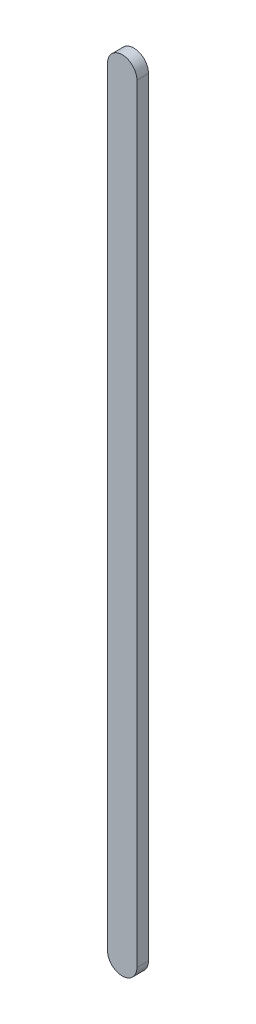
ISO-10303-21;
HEADER;
FILE_DESCRIPTION(('STEP AP214'),'2;1');
FILE_NAME('part.step','',(''),(''),'','','');
FILE_SCHEMA(('AUTOMOTIVE_DESIGN { 1 0 10303 214 1 1 1 1 }'));
ENDSEC;
DATA;
#1=APPLICATION_CONTEXT('core data for automotive mechanical design processes');
#2=APPLICATION_PROTOCOL_DEFINITION('international standard','automotive_design',2000,#1);
#3=PRODUCT_CONTEXT('',#1,'mechanical');
#4=PRODUCT('Part','Part','',(#3));
#5=PRODUCT_RELATED_PRODUCT_CATEGORY('part','',(#4));
#6=PRODUCT_DEFINITION_FORMATION('','',#4);
#7=PRODUCT_DEFINITION_CONTEXT('part definition',#1,'design');
#8=PRODUCT_DEFINITION('design','',#6,#7);
#9=PRODUCT_DEFINITION_SHAPE('','',#8);
#10=(LENGTH_UNIT() NAMED_UNIT(*) SI_UNIT(.MILLI.,.METRE.));
#11=(NAMED_UNIT(*) PLANE_ANGLE_UNIT() SI_UNIT($,.RADIAN.));
#12=(NAMED_UNIT(*) SI_UNIT($,.STERADIAN.) SOLID_ANGLE_UNIT());
#13=UNCERTAINTY_MEASURE_WITH_UNIT(LENGTH_MEASURE(1.E-05),#10,'distance_accuracy_value','');
#14=(GEOMETRIC_REPRESENTATION_CONTEXT(3) GLOBAL_UNCERTAINTY_ASSIGNED_CONTEXT((#13)) GLOBAL_UNIT_ASSIGNED_CONTEXT((#10,
#11,#12)) REPRESENTATION_CONTEXT('',''));
#15=CARTESIAN_POINT('',(0.,0.,0.));
#16=DIRECTION('',(0.,0.,1.));
#17=DIRECTION('',(1.,0.,0.));
#18=AXIS2_PLACEMENT_3D('',#15,#16,#17);
#19=CARTESIAN_POINT('',(107.4928,73.279,0.));
#20=DIRECTION('',(-1.,0.,0.));
#21=DIRECTION('',(0.,1.,0.));
#22=AXIS2_PLACEMENT_3D('',#19,#20,#21);
#23=PLANE('',#22);
#24=DIRECTION('',(0.,1.,0.));
#25=VECTOR('',#24,1.);
#26=CARTESIAN_POINT('',(107.4928,73.279,0.1999996));
#27=LINE('',#26,#25);
#28=CARTESIAN_POINT('',(107.4928,73.279,0.1999996));
#29=VERTEX_POINT('',#28);
#30=CARTESIAN_POINT('',(107.4928,86.5348028,0.1999996));
#31=VERTEX_POINT('',#30);
#32=EDGE_CURVE('E11',#29,#31,#27,.T.);
#33=ORIENTED_EDGE('',*,*,#32,.F.);
#34=DIRECTION('',(0.,0.,1.));
#35=VECTOR('',#34,1.);
#36=CARTESIAN_POINT('',(107.4928,73.279,0.));
#37=LINE('',#36,#35);
#38=CARTESIAN_POINT('',(107.4928,73.279,0.));
#39=VERTEX_POINT('',#38);
#40=EDGE_CURVE('E24',#39,#29,#37,.T.);
#41=ORIENTED_EDGE('',*,*,#40,.F.);
#42=DIRECTION('',(0.,1.,0.));
#43=VECTOR('',#42,1.);
#44=CARTESIAN_POINT('',(107.4928,73.279,0.));
#45=LINE('',#44,#43);
#46=CARTESIAN_POINT('',(107.4928,86.5348028,0.));
#47=VERTEX_POINT('',#46);
#48=EDGE_CURVE('E75',#39,#47,#45,.T.);
#49=ORIENTED_EDGE('',*,*,#48,.T.);
#50=DIRECTION('',(0.,0.,1.));
#51=VECTOR('',#50,1.);
#52=CARTESIAN_POINT('',(107.4928,86.5348028,0.));
#53=LINE('',#52,#51);
#54=EDGE_CURVE('E37',#47,#31,#53,.T.);
#55=ORIENTED_EDGE('',*,*,#54,.T.);
#56=EDGE_LOOP('',(#33,#41,#49,#55));
#57=FACE_BOUND('',#56,.T.);
#58=ADVANCED_FACE('F17',(#57),#23,.F.);
#59=CARTESIAN_POINT('',(107.2388,86.5348028,0.));
#60=DIRECTION('',(0.,0.,-1.));
#61=DIRECTION('',(1.,0.,0.));
#62=AXIS2_PLACEMENT_3D('',#59,#60,#61);
#63=CYLINDRICAL_SURFACE('',#62,0.253999999999995);
#64=CARTESIAN_POINT('',(107.2388,86.5348028,0.1999996));
#65=DIRECTION('',(0.,0.,1.));
#66=DIRECTION('',(1.,0.,0.));
#67=AXIS2_PLACEMENT_3D('',#64,#65,#66);
#68=CIRCLE('',#67,0.253999999999995);
#69=CARTESIAN_POINT('',(106.9848,86.5348028,0.1999996));
#70=VERTEX_POINT('',#69);
#71=EDGE_CURVE('E83',#31,#70,#68,.T.);
#72=ORIENTED_EDGE('',*,*,#71,.F.);
#73=ORIENTED_EDGE('',*,*,#54,.F.);
#74=CARTESIAN_POINT('',(107.2388,86.5348028,0.));
#75=DIRECTION('',(0.,0.,1.));
#76=DIRECTION('',(1.,0.,0.));
#77=AXIS2_PLACEMENT_3D('',#74,#75,#76);
#78=CIRCLE('',#77,0.253999999999995);
#79=CARTESIAN_POINT('',(106.9848,86.5348028,0.));
#80=VERTEX_POINT('',#79);
#81=EDGE_CURVE('E81',#47,#80,#78,.T.);
#82=ORIENTED_EDGE('',*,*,#81,.T.);
#83=DIRECTION('',(0.,0.,1.));
#84=VECTOR('',#83,1.);
#85=CARTESIAN_POINT('',(106.9848,86.5348028,0.));
#86=LINE('',#85,#84);
#87=EDGE_CURVE('E67',#80,#70,#86,.T.);
#88=ORIENTED_EDGE('',*,*,#87,.T.);
#89=EDGE_LOOP('',(#72,#73,#82,#88));
#90=FACE_BOUND('',#89,.T.);
#91=ADVANCED_FACE('F89',(#90),#63,.T.);
#92=CARTESIAN_POINT('',(106.9848,86.5348028,0.));
#93=DIRECTION('',(1.,0.,0.));
#94=DIRECTION('',(0.,-1.,0.));
#95=AXIS2_PLACEMENT_3D('',#92,#93,#94);
#96=PLANE('',#95);
#97=DIRECTION('',(0.,-1.,0.));
#98=VECTOR('',#97,1.);
#99=CARTESIAN_POINT('',(106.9848,86.5348028,0.1999996));
#100=LINE('',#99,#98);
#101=CARTESIAN_POINT('',(106.9848,73.279,0.1999996));
#102=VERTEX_POINT('',#101);
#103=EDGE_CURVE('E71',#70,#102,#100,.T.);
#104=ORIENTED_EDGE('',*,*,#103,.F.);
#105=ORIENTED_EDGE('',*,*,#87,.F.);
#106=DIRECTION('',(0.,-1.,0.));
#107=VECTOR('',#106,1.);
#108=CARTESIAN_POINT('',(106.9848,86.5348028,0.));
#109=LINE('',#108,#107);
#110=CARTESIAN_POINT('',(106.9848,73.279,0.));
#111=VERTEX_POINT('',#110);
#112=EDGE_CURVE('E63',#80,#111,#109,.T.);
#113=ORIENTED_EDGE('',*,*,#112,.T.);
#114=DIRECTION('',(0.,0.,1.));
#115=VECTOR('',#114,1.);
#116=CARTESIAN_POINT('',(106.9848,73.279,0.));
#117=LINE('',#116,#115);
#118=EDGE_CURVE('E53',#111,#102,#117,.T.);
#119=ORIENTED_EDGE('',*,*,#118,.T.);
#120=EDGE_LOOP('',(#104,#105,#113,#119));
#121=FACE_BOUND('',#120,.T.);
#122=ADVANCED_FACE('F66',(#121),#96,.F.);
#123=CARTESIAN_POINT('',(107.2388,73.279,0.));
#124=DIRECTION('',(0.,0.,-1.));
#125=DIRECTION('',(-1.,0.,0.));
#126=AXIS2_PLACEMENT_3D('',#123,#124,#125);
#127=CYLINDRICAL_SURFACE('',#126,0.254);
#128=CARTESIAN_POINT('',(107.2388,73.279,0.1999996));
#129=DIRECTION('',(0.,0.,1.));
#130=DIRECTION('',(-1.,0.,0.));
#131=AXIS2_PLACEMENT_3D('',#128,#129,#130);
#132=CIRCLE('',#131,0.254);
#133=EDGE_CURVE('E59',#102,#29,#132,.T.);
#134=ORIENTED_EDGE('',*,*,#133,.F.);
#135=ORIENTED_EDGE('',*,*,#118,.F.);
#136=CARTESIAN_POINT('',(107.2388,73.279,0.));
#137=DIRECTION('',(0.,0.,1.));
#138=DIRECTION('',(-1.,0.,0.));
#139=AXIS2_PLACEMENT_3D('',#136,#137,#138);
#140=CIRCLE('',#139,0.254);
#141=EDGE_CURVE('E57',#111,#39,#140,.T.);
#142=ORIENTED_EDGE('',*,*,#141,.T.);
#143=ORIENTED_EDGE('',*,*,#40,.T.);
#144=EDGE_LOOP('',(#134,#135,#142,#143));
#145=FACE_BOUND('',#144,.T.);
#146=ADVANCED_FACE('F55',(#145),#127,.T.);
#147=CARTESIAN_POINT('',(107.4928,73.279,0.));
#148=DIRECTION('',(0.,0.,-1.));
#149=DIRECTION('',(-1.,0.,0.));
#150=AXIS2_PLACEMENT_3D('',#147,#148,#149);
#151=PLANE('',#150);
#152=ORIENTED_EDGE('',*,*,#141,.F.);
#153=ORIENTED_EDGE('',*,*,#112,.F.);
#154=ORIENTED_EDGE('',*,*,#81,.F.);
#155=ORIENTED_EDGE('',*,*,#48,.F.);
#156=EDGE_LOOP('',(#152,#153,#154,#155));
#157=FACE_BOUND('',#156,.T.);
#158=ADVANCED_FACE('F74',(#157),#151,.T.);
#159=CARTESIAN_POINT('',(107.4928,73.279,0.1999996));
#160=DIRECTION('',(0.,0.,-1.));
#161=DIRECTION('',(-1.,0.,0.));
#162=AXIS2_PLACEMENT_3D('',#159,#160,#161);
#163=PLANE('',#162);
#164=ORIENTED_EDGE('',*,*,#32,.T.);
#165=ORIENTED_EDGE('',*,*,#71,.T.);
#166=ORIENTED_EDGE('',*,*,#103,.T.);
#167=ORIENTED_EDGE('',*,*,#133,.T.);
#168=EDGE_LOOP('',(#164,#165,#166,#167));
#169=FACE_BOUND('',#168,.T.);
#170=ADVANCED_FACE('F91',(#169),#163,.F.);
#171=CLOSED_SHELL('',(#58,#91,#122,#146,#158,#170));
#172=MANIFOLD_SOLID_BREP('B1',#171);
#173=ADVANCED_BREP_SHAPE_REPRESENTATION('',(#18,#172),#14);
#174=SHAPE_DEFINITION_REPRESENTATION(#9,#173);
ENDSEC;
END-ISO-10303-21;
